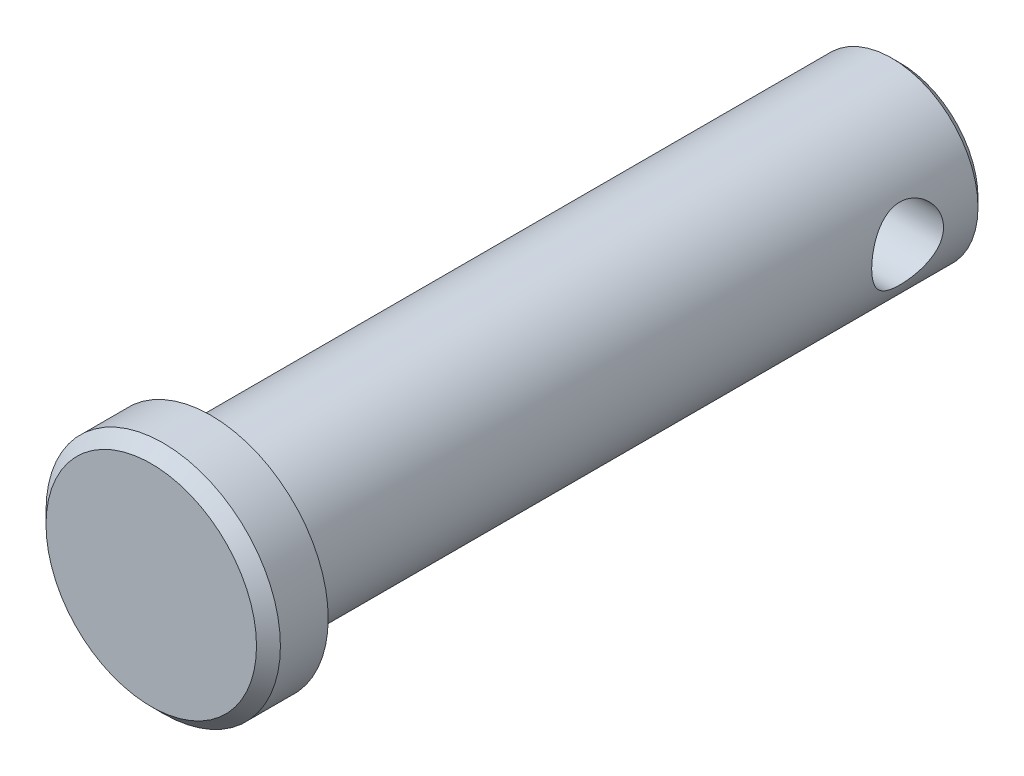
ISO-10303-21;
HEADER;
FILE_DESCRIPTION(('STEP AP214'),'2;1');
FILE_NAME('part.step','',(''),(''),'','','');
FILE_SCHEMA(('AUTOMOTIVE_DESIGN { 1 0 10303 214 1 1 1 1 }'));
ENDSEC;
DATA;
#1=APPLICATION_CONTEXT('core data for automotive mechanical design processes');
#2=APPLICATION_PROTOCOL_DEFINITION('international standard','automotive_design',2000,#1);
#3=PRODUCT_CONTEXT('',#1,'mechanical');
#4=PRODUCT('Part','Part','',(#3));
#5=PRODUCT_RELATED_PRODUCT_CATEGORY('part','',(#4));
#6=PRODUCT_DEFINITION_FORMATION('','',#4);
#7=PRODUCT_DEFINITION_CONTEXT('part definition',#1,'design');
#8=PRODUCT_DEFINITION('design','',#6,#7);
#9=PRODUCT_DEFINITION_SHAPE('','',#8);
#10=(LENGTH_UNIT() NAMED_UNIT(*) SI_UNIT(.MILLI.,.METRE.));
#11=(NAMED_UNIT(*) PLANE_ANGLE_UNIT() SI_UNIT($,.RADIAN.));
#12=(NAMED_UNIT(*) SI_UNIT($,.STERADIAN.) SOLID_ANGLE_UNIT());
#13=UNCERTAINTY_MEASURE_WITH_UNIT(LENGTH_MEASURE(1.E-05),#10,'distance_accuracy_value','');
#14=(GEOMETRIC_REPRESENTATION_CONTEXT(3) GLOBAL_UNCERTAINTY_ASSIGNED_CONTEXT((#13)) GLOBAL_UNIT_ASSIGNED_CONTEXT((#10,
#11,#12)) REPRESENTATION_CONTEXT('',''));
#15=CARTESIAN_POINT('',(0.,0.,0.));
#16=DIRECTION('',(0.,0.,1.));
#17=DIRECTION('',(1.,0.,0.));
#18=AXIS2_PLACEMENT_3D('',#15,#16,#17);
#19=CARTESIAN_POINT('',(0.,0.,19.05));
#20=DIRECTION('',(0.,0.,-1.));
#21=DIRECTION('',(-1.,0.,0.));
#22=AXIS2_PLACEMENT_3D('',#19,#20,#21);
#23=CYLINDRICAL_SURFACE('',#22,4.7625);
#24=CARTESIAN_POINT('',(0.,0.,-18.57375));
#25=DIRECTION('',(0.,0.,1.));
#26=DIRECTION('',(1.,0.,0.));
#27=AXIS2_PLACEMENT_3D('',#24,#25,#26);
#28=CIRCLE('',#27,4.7625);
#29=CARTESIAN_POINT('',(4.7625,0.,-18.57375));
#30=VERTEX_POINT('',#29);
#31=EDGE_CURVE('E40',#30,#30,#28,.T.);
#32=ORIENTED_EDGE('',*,*,#31,.T.);
#33=EDGE_LOOP('',(#32));
#34=FACE_BOUND('',#33,.T.);
#35=CARTESIAN_POINT('',(-4.7625,0.,-12.7));
#36=CARTESIAN_POINT('',(-4.76249140158045,-0.106295908560072,-12.7000114380824));
#37=CARTESIAN_POINT('',(-4.75890007347352,-0.212758967838845,-12.7085914841634));
#38=CARTESIAN_POINT('',(-4.74488118807538,-0.422667701710698,-12.7426070155608));
#39=CARTESIAN_POINT('',(-4.73443579242881,-0.526104765072406,-12.768086485087));
#40=CARTESIAN_POINT('',(-4.70783108848027,-0.726580864674275,-12.8347963582017));
#41=CARTESIAN_POINT('',(-4.69169114960318,-0.8236402825267,-12.8759734057807));
#42=CARTESIAN_POINT('',(-4.65526892272179,-1.00937973872918,-12.9726893568817));
#43=CARTESIAN_POINT('',(-4.63498788984898,-1.0980623041503,-13.0282239101163));
#44=CARTESIAN_POINT('',(-4.59117427508592,-1.26912434065072,-13.155023509863));
#45=CARTESIAN_POINT('',(-4.56753520905172,-1.35102801218445,-13.2268933277037));
#46=CARTESIAN_POINT('',(-4.52013183583765,-1.50202871598238,-13.3830446314673));
#47=CARTESIAN_POINT('',(-4.4963674694456,-1.57111900525552,-13.46733261077));
#48=CARTESIAN_POINT('',(-4.4500962212813,-1.69789058594091,-13.6509550093843));
#49=CARTESIAN_POINT('',(-4.42770874161498,-1.75484326694356,-13.7508256993771));
#50=CARTESIAN_POINT('',(-4.38841471116746,-1.85092880684824,-13.9597975469495));
#51=CARTESIAN_POINT('',(-4.37150533813807,-1.89007084577611,-14.0688939149316));
#52=CARTESIAN_POINT('',(-4.34623456677981,-1.94745924820552,-14.2877439856816));
#53=CARTESIAN_POINT('',(-4.33750065397212,-1.96662131880699,-14.397212892385));
#54=CARTESIAN_POINT('',(-4.32849855373462,-1.98636270823876,-14.6181338521399));
#55=CARTESIAN_POINT('',(-4.328225697501,-1.98695227536355,-14.7295847775409));
#56=CARTESIAN_POINT('',(-4.33586127302854,-1.97022164952332,-14.9421850959405));
#57=CARTESIAN_POINT('',(-4.34314413823751,-1.95427093765777,-15.0434692407961));
#58=CARTESIAN_POINT('',(-4.36401341403402,-1.90720965737545,-15.2417654444631));
#59=CARTESIAN_POINT('',(-4.37760103179407,-1.87609618568393,-15.3387766812432));
#60=CARTESIAN_POINT('',(-4.40985568326751,-1.79898609480019,-15.5282228534989));
#61=CARTESIAN_POINT('',(-4.42862465094254,-1.75268686068537,-15.6205164807));
#62=CARTESIAN_POINT('',(-4.46910350686474,-1.64673347596642,-15.7963834025347));
#63=CARTESIAN_POINT('',(-4.49081455356025,-1.58707405869977,-15.879953239099));
#64=CARTESIAN_POINT('',(-4.53696350793792,-1.45017484530084,-16.0434336844884));
#65=CARTESIAN_POINT('',(-4.561476802296,-1.37187540459195,-16.1224381757244));
#66=CARTESIAN_POINT('',(-4.6089200606614,-1.20289572579427,-16.2664989359477));
#67=CARTESIAN_POINT('',(-4.63184965292253,-1.11221259562442,-16.3315519375613));
#68=CARTESIAN_POINT('',(-4.67420775145901,-0.918286118550734,-16.4471918699908));
#69=CARTESIAN_POINT('',(-4.69354323137542,-0.814801174635692,-16.4974102441767));
#70=CARTESIAN_POINT('',(-4.72582051746,-0.599840689011346,-16.5794073091202));
#71=CARTESIAN_POINT('',(-4.73876585655208,-0.488369601737119,-16.6111961907108));
#72=CARTESIAN_POINT('',(-4.75614430383386,-0.268173379937138,-16.653535387501));
#73=CARTESIAN_POINT('',(-4.76106396412311,-0.159720415379841,-16.6653017236919));
#74=CARTESIAN_POINT('',(-4.76338979960382,0.0577130156000396,-16.6708871299874));
#75=CARTESIAN_POINT('',(-4.76079813192703,0.166693321604807,-16.664711352775));
#76=CARTESIAN_POINT('',(-4.74870808030392,0.376393459717026,-16.6354584028704));
#77=CARTESIAN_POINT('',(-4.73955883563333,0.477254834540024,-16.6132351978707));
#78=CARTESIAN_POINT('',(-4.71564663251208,0.673707613991605,-16.5537067411665));
#79=CARTESIAN_POINT('',(-4.7008829648603,0.769298351097896,-16.5163995840539));
#80=CARTESIAN_POINT('',(-4.666587546492,0.955848037292252,-16.426543576057));
#81=CARTESIAN_POINT('',(-4.64692192707484,1.04657086350783,-16.3735572592557));
#82=CARTESIAN_POINT('',(-4.60492164769306,1.21816211826739,-16.2543277627557));
#83=CARTESIAN_POINT('',(-4.58258587495364,1.29902640975558,-16.1880790481973));
#84=CARTESIAN_POINT('',(-4.53567939534007,1.45467932056039,-16.03866611718));
#85=CARTESIAN_POINT('',(-4.51106304400759,1.52862073304299,-15.9546313765093));
#86=CARTESIAN_POINT('',(-4.46380134619208,1.66158838069249,-15.7749537244526));
#87=CARTESIAN_POINT('',(-4.44115644808334,1.72061122865917,-15.6793081841649));
#88=CARTESIAN_POINT('',(-4.40025450662331,1.8227033683131,-15.4771499967072));
#89=CARTESIAN_POINT('',(-4.3820645555624,1.86553345201759,-15.3705019686202));
#90=CARTESIAN_POINT('',(-4.35305764608595,1.93226394648122,-15.1505116823265));
#91=CARTESIAN_POINT('',(-4.34223460919757,1.95617996596104,-15.0371750270577));
#92=CARTESIAN_POINT('',(-4.33011523702907,1.98285227553879,-14.8164253150213));
#93=CARTESIAN_POINT('',(-4.32814969660371,1.98709566405842,-14.7092278486105));
#94=CARTESIAN_POINT('',(-4.33218991655001,1.9782722614421,-14.4957119579385));
#95=CARTESIAN_POINT('',(-4.33819445320237,1.96520812768995,-14.389393401252));
#96=CARTESIAN_POINT('',(-4.3568866269235,1.92338967589029,-14.1857527633931));
#97=CARTESIAN_POINT('',(-4.36925013318788,1.89539409419702,-14.0882422808769));
#98=CARTESIAN_POINT('',(-4.39901300153713,1.82524921020888,-13.8992800160954));
#99=CARTESIAN_POINT('',(-4.41641377846563,1.78309593083637,-13.8078299449294));
#100=CARTESIAN_POINT('',(-4.45558790364021,1.68291328922589,-13.6275827651808));
#101=CARTESIAN_POINT('',(-4.47756125557966,1.62408172945392,-13.5392758008578));
#102=CARTESIAN_POINT('',(-4.5228460637297,1.49333596530074,-13.3733220287649));
#103=CARTESIAN_POINT('',(-4.54615798199076,1.42141722463767,-13.2956789337341));
#104=CARTESIAN_POINT('',(-4.59353273649544,1.26031949767388,-13.1474389678255));
#105=CARTESIAN_POINT('',(-4.61752660299969,1.17026489966908,-13.0777671628655));
#106=CARTESIAN_POINT('',(-4.66185477999957,0.97885262581445,-12.9544771174995));
#107=CARTESIAN_POINT('',(-4.68218742117825,0.877489827988868,-12.9008661926128));
#108=CARTESIAN_POINT('',(-4.71660828587906,0.667912140039744,-12.8123793703642));
#109=CARTESIAN_POINT('',(-4.73079417348867,0.559838210681758,-12.777208432995));
#110=CARTESIAN_POINT('',(-4.75172103007692,0.338789044681411,-12.7258662025889));
#111=CARTESIAN_POINT('',(-4.75848530476497,0.225830315707269,-12.7096354224838));
#112=CARTESIAN_POINT('',(-4.76206006515682,0.0749872800467031,-12.7010586067753));
#113=CARTESIAN_POINT('',(-4.76250303375275,0.0375040440476054,-12.6999959643381));
#114=CARTESIAN_POINT('',(-4.7625,0.,-12.7));
#115=B_SPLINE_CURVE_WITH_KNOTS('',3,(#35,#36,#37,#38,#39,#40,#41,#42,#43,#44,#45,#46,#47,#48,
#49,#50,#51,#52,#53,#54,#55,#56,#57,#58,#59,#60,#61,#62,#63,#64,#65,#66,#67,#68,#69,#70,#71,#72,
#73,#74,#75,#76,#77,#78,#79,#80,#81,#82,#83,#84,#85,#86,#87,#88,#89,#90,#91,#92,#93,#94,#95,#96,
#97,#98,#99,#100,#101,#102,#103,#104,#105,#106,#107,#108,#109,#110,#111,#112,#113,#114),
.UNSPECIFIED.,.T.,.F.,(4,2,2,2,2,2,2,2,2,2,2,2,2,2,2,2,2,2,2,2,2,2,2,2,2,2,2,2,2,2,2,2,2,2,2,2,
2,2,2,4),(0.,0.31878098372825,0.638394933248055,0.956932064901252,1.27537279350409,
1.60842223858481,1.94164645533701,2.29126612705861,2.64070539184808,2.97331246105872,
3.3057359947036,3.61267624559058,3.91967529066949,4.23320706980709,4.54686266326064,
4.88702574040535,5.22726839536908,5.5753643740904,5.92326768446545,6.24916903886785,
6.57497680895409,6.88461586205456,7.19429404105333,7.51359202244554,7.83302353682823,
8.17528349746503,8.5176210971904,8.86483476520742,9.21176159730895,9.53198305625932,
9.85215535434837,10.1574226931906,10.462775857341,10.7864893076844,11.1103151781368,
11.4577262432026,11.8052953096787,12.1471190861327,12.4878663512005,12.6003408219232),.UNSPECIFIED.);
#116=CARTESIAN_POINT('',(-4.7625,0.,-12.7));
#117=VERTEX_POINT('',#116);
#118=EDGE_CURVE('E51',#117,#117,#115,.T.);
#119=ORIENTED_EDGE('',*,*,#118,.T.);
#120=EDGE_LOOP('',(#119));
#121=FACE_BOUND('',#120,.T.);
#122=CARTESIAN_POINT('',(4.7625,0.,-16.66875));
#123=CARTESIAN_POINT('',(4.76249140158046,-0.106295908560073,-16.6687385619176));
#124=CARTESIAN_POINT('',(4.75890007347352,-0.212758967838847,-16.6601585158366));
#125=CARTESIAN_POINT('',(4.74488118807538,-0.4226677017107,-16.6261429844392));
#126=CARTESIAN_POINT('',(4.73443579242881,-0.526104765072408,-16.600663514913));
#127=CARTESIAN_POINT('',(4.70783108848027,-0.726580864674275,-16.5339536417983));
#128=CARTESIAN_POINT('',(4.69169114960318,-0.823640282526699,-16.4927765942193));
#129=CARTESIAN_POINT('',(4.65526892272179,-1.00937973872918,-16.3960606431183));
#130=CARTESIAN_POINT('',(4.63498788984898,-1.0980623041503,-16.3405260898837));
#131=CARTESIAN_POINT('',(4.59117427508592,-1.26912434065072,-16.213726490137));
#132=CARTESIAN_POINT('',(4.56753520905172,-1.35102801218446,-16.1418566722963));
#133=CARTESIAN_POINT('',(4.52013183583765,-1.50202871598238,-15.9857053685327));
#134=CARTESIAN_POINT('',(4.4963674694456,-1.57111900525552,-15.90141738923));
#135=CARTESIAN_POINT('',(4.4500962212813,-1.69789058594091,-15.7177949906157));
#136=CARTESIAN_POINT('',(4.42770874161498,-1.75484326694356,-15.6179243006229));
#137=CARTESIAN_POINT('',(4.38841471116746,-1.85092880684824,-15.4089524530505));
#138=CARTESIAN_POINT('',(4.37150533813807,-1.89007084577611,-15.2998560850684));
#139=CARTESIAN_POINT('',(4.34623456677981,-1.94745924820552,-15.0810060143184));
#140=CARTESIAN_POINT('',(4.33750065397212,-1.96662131880699,-14.971537107615));
#141=CARTESIAN_POINT('',(4.32849855373462,-1.98636270823876,-14.7506161478601));
#142=CARTESIAN_POINT('',(4.328225697501,-1.98695227536355,-14.6391652224591));
#143=CARTESIAN_POINT('',(4.33586127302854,-1.97022164952332,-14.4265649040595));
#144=CARTESIAN_POINT('',(4.34314413823751,-1.95427093765777,-14.3252807592039));
#145=CARTESIAN_POINT('',(4.36401341403402,-1.90720965737545,-14.1269845555369));
#146=CARTESIAN_POINT('',(4.37760103179407,-1.87609618568393,-14.0299733187568));
#147=CARTESIAN_POINT('',(4.40985568326751,-1.79898609480019,-13.8405271465011));
#148=CARTESIAN_POINT('',(4.42862465094254,-1.75268686068537,-13.7482335193));
#149=CARTESIAN_POINT('',(4.46910350686474,-1.64673347596643,-13.5723665974653));
#150=CARTESIAN_POINT('',(4.49081455356025,-1.58707405869977,-13.488796760901));
#151=CARTESIAN_POINT('',(4.53696350793792,-1.45017484530084,-13.3253163155116));
#152=CARTESIAN_POINT('',(4.561476802296,-1.37187540459195,-13.2463118242756));
#153=CARTESIAN_POINT('',(4.6089200606614,-1.20289572579427,-13.1022510640523));
#154=CARTESIAN_POINT('',(4.63184965292253,-1.11221259562442,-13.0371980624387));
#155=CARTESIAN_POINT('',(4.67420775145901,-0.918286118550734,-12.9215581300092));
#156=CARTESIAN_POINT('',(4.69354323137542,-0.814801174635692,-12.8713397558233));
#157=CARTESIAN_POINT('',(4.72582051746,-0.599840689011345,-12.7893426908798));
#158=CARTESIAN_POINT('',(4.73876585655208,-0.488369601737118,-12.7575538092892));
#159=CARTESIAN_POINT('',(4.75614430383386,-0.268173379937137,-12.715214612499));
#160=CARTESIAN_POINT('',(4.76106396412311,-0.15972041537984,-12.7034482763081));
#161=CARTESIAN_POINT('',(4.76338979960382,0.0577130156000403,-12.6978628700126));
#162=CARTESIAN_POINT('',(4.76079813192703,0.166693321604808,-12.704038647225));
#163=CARTESIAN_POINT('',(4.74870808030392,0.376393459717027,-12.7332915971296));
#164=CARTESIAN_POINT('',(4.73955883563333,0.477254834540025,-12.7555148021293));
#165=CARTESIAN_POINT('',(4.71564663251208,0.673707613991605,-12.8150432588335));
#166=CARTESIAN_POINT('',(4.70088296486029,0.769298351097896,-12.8523504159461));
#167=CARTESIAN_POINT('',(4.666587546492,0.955848037292252,-12.942206423943));
#168=CARTESIAN_POINT('',(4.64692192707484,1.04657086350782,-12.9951927407443));
#169=CARTESIAN_POINT('',(4.60492164769306,1.21816211826739,-13.1144222372443));
#170=CARTESIAN_POINT('',(4.58258587495364,1.29902640975558,-13.1806709518027));
#171=CARTESIAN_POINT('',(4.53567939534007,1.45467932056039,-13.3300838828199));
#172=CARTESIAN_POINT('',(4.51106304400759,1.52862073304299,-13.4141186234907));
#173=CARTESIAN_POINT('',(4.46380134619208,1.66158838069249,-13.5937962755474));
#174=CARTESIAN_POINT('',(4.44115644808334,1.72061122865917,-13.6894418158351));
#175=CARTESIAN_POINT('',(4.40025450662331,1.8227033683131,-13.8916000032928));
#176=CARTESIAN_POINT('',(4.3820645555624,1.86553345201759,-13.9982480313798));
#177=CARTESIAN_POINT('',(4.35305764608594,1.93226394648122,-14.2182383176735));
#178=CARTESIAN_POINT('',(4.34223460919756,1.95617996596104,-14.3315749729423));
#179=CARTESIAN_POINT('',(4.33011523702907,1.98285227553879,-14.5523246849787));
#180=CARTESIAN_POINT('',(4.32814969660371,1.98709566405842,-14.6595221513895));
#181=CARTESIAN_POINT('',(4.33218991655001,1.9782722614421,-14.8730380420615));
#182=CARTESIAN_POINT('',(4.33819445320237,1.96520812768995,-14.979356598748));
#183=CARTESIAN_POINT('',(4.3568866269235,1.92338967589029,-15.1829972366069));
#184=CARTESIAN_POINT('',(4.36925013318788,1.89539409419702,-15.2805077191231));
#185=CARTESIAN_POINT('',(4.39901300153713,1.82524921020888,-15.4694699839046));
#186=CARTESIAN_POINT('',(4.41641377846563,1.78309593083637,-15.5609200550706));
#187=CARTESIAN_POINT('',(4.45558790364021,1.68291328922589,-15.7411672348192));
#188=CARTESIAN_POINT('',(4.47756125557966,1.62408172945392,-15.8294741991422));
#189=CARTESIAN_POINT('',(4.5228460637297,1.49333596530074,-15.9954279712351));
#190=CARTESIAN_POINT('',(4.54615798199076,1.42141722463767,-16.0730710662659));
#191=CARTESIAN_POINT('',(4.59353273649544,1.26031949767387,-16.2213110321745));
#192=CARTESIAN_POINT('',(4.61752660299969,1.17026489966908,-16.2909828371345));
#193=CARTESIAN_POINT('',(4.66185477999957,0.978852625814449,-16.4142728825005));
#194=CARTESIAN_POINT('',(4.68218742117825,0.877489827988868,-16.4678838073872));
#195=CARTESIAN_POINT('',(4.71660828587906,0.667912140039744,-16.5563706296358));
#196=CARTESIAN_POINT('',(4.73079417348868,0.559838210681757,-16.591541567005));
#197=CARTESIAN_POINT('',(4.75172103007692,0.33878904468141,-16.6428837974111));
#198=CARTESIAN_POINT('',(4.75848530476497,0.225830315707268,-16.6591145775162));
#199=CARTESIAN_POINT('',(4.76206006515682,0.0749872800467027,-16.6676913932247));
#200=CARTESIAN_POINT('',(4.76250303375276,0.0375040440476052,-16.6687540356619));
#201=CARTESIAN_POINT('',(4.7625,0.,-16.66875));
#202=B_SPLINE_CURVE_WITH_KNOTS('',3,(#122,#123,#124,#125,#126,#127,#128,#129,#130,#131,#132,
#133,#134,#135,#136,#137,#138,#139,#140,#141,#142,#143,#144,#145,#146,#147,#148,#149,#150,#151,
#152,#153,#154,#155,#156,#157,#158,#159,#160,#161,#162,#163,#164,#165,#166,#167,#168,#169,#170,
#171,#172,#173,#174,#175,#176,#177,#178,#179,#180,#181,#182,#183,#184,#185,#186,#187,#188,#189,
#190,#191,#192,#193,#194,#195,#196,#197,#198,#199,#200,#201),.UNSPECIFIED.,.T.,.F.,(4,2,2,2,2,2,
2,2,2,2,2,2,2,2,2,2,2,2,2,2,2,2,2,2,2,2,2,2,2,2,2,2,2,2,2,2,2,2,2,4),(0.,0.318780983728252,
0.638394933248055,0.956932064901251,1.27537279350409,1.60842223858481,1.94164645533701,
2.29126612705861,2.64070539184808,2.97331246105872,3.3057359947036,3.61267624559057,
3.91967529066949,4.23320706980708,4.54686266326064,4.88702574040535,5.22726839536907,
5.5753643740904,5.92326768446545,6.24916903886785,6.57497680895409,6.88461586205456,
7.19429404105332,7.51359202244554,7.83302353682823,8.17528349746503,8.5176210971904,
8.86483476520742,9.21176159730895,9.53198305625933,9.85215535434837,10.1574226931906,
10.462775857341,10.7864893076844,11.1103151781368,11.4577262432026,11.8052953096787,
12.1471190861327,12.4878663512005,12.6003408219232),.UNSPECIFIED.);
#203=CARTESIAN_POINT('',(4.7625,0.,-16.66875));
#204=VERTEX_POINT('',#203);
#205=EDGE_CURVE('E59',#204,#204,#202,.T.);
#206=ORIENTED_EDGE('',*,*,#205,.T.);
#207=EDGE_LOOP('',(#206));
#208=FACE_BOUND('',#207,.T.);
#209=CARTESIAN_POINT('',(0.,0.,19.05));
#210=DIRECTION('',(0.,0.,1.));
#211=DIRECTION('',(1.,0.,0.));
#212=AXIS2_PLACEMENT_3D('',#209,#210,#211);
#213=CIRCLE('',#212,4.7625);
#214=CARTESIAN_POINT('',(4.7625,0.,19.05));
#215=VERTEX_POINT('',#214);
#216=EDGE_CURVE('E97',#215,#215,#213,.T.);
#217=ORIENTED_EDGE('',*,*,#216,.F.);
#218=EDGE_LOOP('',(#217));
#219=FACE_BOUND('',#218,.T.);
#220=ADVANCED_FACE('F33',(#34,#121,#208,#219),#23,.T.);
#221=CARTESIAN_POINT('',(0.,0.,-19.05));
#222=DIRECTION('',(0.,0.,1.));
#223=DIRECTION('',(1.,0.,0.));
#224=AXIS2_PLACEMENT_3D('',#221,#222,#223);
#225=PLANE('',#224);
#226=CARTESIAN_POINT('',(0.,0.,-19.05));
#227=DIRECTION('',(0.,0.,1.));
#228=DIRECTION('',(1.,0.,0.));
#229=AXIS2_PLACEMENT_3D('',#226,#227,#228);
#230=CIRCLE('',#229,4.28624999999996);
#231=CARTESIAN_POINT('',(4.28624999999996,0.,-19.05));
#232=VERTEX_POINT('',#231);
#233=EDGE_CURVE('E10',#232,#232,#230,.F.);
#234=ORIENTED_EDGE('',*,*,#233,.T.);
#235=EDGE_LOOP('',(#234));
#236=FACE_BOUND('',#235,.T.);
#237=ADVANCED_FACE('F79',(#236),#225,.F.);
#238=CARTESIAN_POINT('',(0.,0.,19.05));
#239=DIRECTION('',(0.,0.,1.));
#240=DIRECTION('',(1.,0.,0.));
#241=AXIS2_PLACEMENT_3D('',#238,#239,#240);
#242=PLANE('',#241);
#243=CARTESIAN_POINT('',(0.,0.,19.05));
#244=DIRECTION('',(0.,0.,1.));
#245=DIRECTION('',(1.,0.,0.));
#246=AXIS2_PLACEMENT_3D('',#243,#244,#245);
#247=CIRCLE('',#246,6.477);
#248=CARTESIAN_POINT('',(-6.477,0.,19.05));
#249=VERTEX_POINT('',#248);
#250=EDGE_CURVE('E58',#249,#249,#247,.T.);
#251=ORIENTED_EDGE('',*,*,#250,.F.);
#252=EDGE_LOOP('',(#251));
#253=FACE_BOUND('',#252,.T.);
#254=ORIENTED_EDGE('',*,*,#216,.T.);
#255=EDGE_LOOP('',(#254));
#256=FACE_BOUND('',#255,.T.);
#257=ADVANCED_FACE('F76',(#253,#256),#242,.F.);
#258=CARTESIAN_POINT('',(0.,0.,22.352));
#259=DIRECTION('',(0.,0.,-1.));
#260=DIRECTION('',(-1.,0.,0.));
#261=AXIS2_PLACEMENT_3D('',#258,#259,#260);
#262=CYLINDRICAL_SURFACE('',#261,6.477);
#263=CARTESIAN_POINT('',(0.,0.,21.6916));
#264=DIRECTION('',(0.,0.,1.));
#265=DIRECTION('',(1.,0.,0.));
#266=AXIS2_PLACEMENT_3D('',#263,#264,#265);
#267=CIRCLE('',#266,6.477);
#268=CARTESIAN_POINT('',(-6.477,0.,21.6916));
#269=VERTEX_POINT('',#268);
#270=EDGE_CURVE('E44',#269,#269,#267,.F.);
#271=CARTESIAN_POINT('',(-6.477,0.,21.6916));
#272=CARTESIAN_POINT('',(-6.477,0.,21.6640833333334));
#273=CARTESIAN_POINT('',(-6.477,0.,21.6365666666667));
#274=CARTESIAN_POINT('',(-6.477,0.,21.5815333333334));
#275=CARTESIAN_POINT('',(-6.477,0.,21.5540166666667));
#276=CARTESIAN_POINT('',(-6.477,0.,21.4989833333334));
#277=CARTESIAN_POINT('',(-6.477,0.,21.4714666666667));
#278=CARTESIAN_POINT('',(-6.477,0.,21.4164333333334));
#279=CARTESIAN_POINT('',(-6.477,0.,21.3889166666667));
#280=CARTESIAN_POINT('',(-6.477,0.,21.3338833333334));
#281=CARTESIAN_POINT('',(-6.477,0.,21.3063666666667));
#282=CARTESIAN_POINT('',(-6.477,0.,21.2513333333334));
#283=CARTESIAN_POINT('',(-6.477,0.,21.2238166666667));
#284=CARTESIAN_POINT('',(-6.477,0.,21.1687833333334));
#285=CARTESIAN_POINT('',(-6.477,0.,21.1412666666667));
#286=CARTESIAN_POINT('',(-6.477,0.,21.0862333333334));
#287=CARTESIAN_POINT('',(-6.477,0.,21.0587166666667));
#288=CARTESIAN_POINT('',(-6.477,0.,21.0036833333333));
#289=CARTESIAN_POINT('',(-6.477,0.,20.9761666666667));
#290=CARTESIAN_POINT('',(-6.477,0.,20.9211333333333));
#291=CARTESIAN_POINT('',(-6.477,0.,20.8936166666667));
#292=CARTESIAN_POINT('',(-6.477,0.,20.8385833333333));
#293=CARTESIAN_POINT('',(-6.477,0.,20.8110666666667));
#294=CARTESIAN_POINT('',(-6.477,0.,20.7560333333333));
#295=CARTESIAN_POINT('',(-6.477,0.,20.7285166666667));
#296=CARTESIAN_POINT('',(-6.477,0.,20.6734833333333));
#297=CARTESIAN_POINT('',(-6.477,0.,20.6459666666667));
#298=CARTESIAN_POINT('',(-6.477,0.,20.5909333333333));
#299=CARTESIAN_POINT('',(-6.477,0.,20.5634166666667));
#300=CARTESIAN_POINT('',(-6.477,0.,20.5083833333333));
#301=CARTESIAN_POINT('',(-6.477,0.,20.4808666666667));
#302=CARTESIAN_POINT('',(-6.477,0.,20.4258333333333));
#303=CARTESIAN_POINT('',(-6.477,0.,20.3983166666667));
#304=CARTESIAN_POINT('',(-6.477,0.,20.3432833333333));
#305=CARTESIAN_POINT('',(-6.477,0.,20.3157666666667));
#306=CARTESIAN_POINT('',(-6.477,0.,20.2607333333333));
#307=CARTESIAN_POINT('',(-6.477,0.,20.2332166666667));
#308=CARTESIAN_POINT('',(-6.477,0.,20.1781833333333));
#309=CARTESIAN_POINT('',(-6.477,0.,20.1506666666667));
#310=CARTESIAN_POINT('',(-6.477,0.,20.0956333333333));
#311=CARTESIAN_POINT('',(-6.477,0.,20.0681166666667));
#312=CARTESIAN_POINT('',(-6.477,0.,20.0130833333333));
#313=CARTESIAN_POINT('',(-6.477,0.,19.9855666666667));
#314=CARTESIAN_POINT('',(-6.477,0.,19.9305333333333));
#315=CARTESIAN_POINT('',(-6.477,0.,19.9030166666667));
#316=CARTESIAN_POINT('',(-6.477,0.,19.8479833333333));
#317=CARTESIAN_POINT('',(-6.477,0.,19.8204666666667));
#318=CARTESIAN_POINT('',(-6.477,0.,19.7654333333333));
#319=CARTESIAN_POINT('',(-6.477,0.,19.7379166666667));
#320=CARTESIAN_POINT('',(-6.477,0.,19.6828833333333));
#321=CARTESIAN_POINT('',(-6.477,0.,19.6553666666667));
#322=CARTESIAN_POINT('',(-6.477,0.,19.6003333333333));
#323=CARTESIAN_POINT('',(-6.477,0.,19.5728166666667));
#324=CARTESIAN_POINT('',(-6.477,0.,19.5177833333333));
#325=CARTESIAN_POINT('',(-6.477,0.,19.4902666666667));
#326=CARTESIAN_POINT('',(-6.477,0.,19.4352333333333));
#327=CARTESIAN_POINT('',(-6.477,0.,19.4077166666667));
#328=CARTESIAN_POINT('',(-6.477,0.,19.3526833333333));
#329=CARTESIAN_POINT('',(-6.477,0.,19.3251666666667));
#330=CARTESIAN_POINT('',(-6.477,0.,19.2701333333333));
#331=CARTESIAN_POINT('',(-6.477,0.,19.2426166666667));
#332=CARTESIAN_POINT('',(-6.477,0.,19.1875833333333));
#333=CARTESIAN_POINT('',(-6.477,0.,19.1600666666667));
#334=CARTESIAN_POINT('',(-6.477,0.,19.1050333333333));
#335=CARTESIAN_POINT('',(-6.477,0.,19.0775166666667));
#336=CARTESIAN_POINT('',(-6.477,0.,19.05));
#337=B_SPLINE_CURVE_WITH_KNOTS('',3,(#271,#272,#273,#274,#275,#276,#277,#278,#279,#280,#281,
#282,#283,#284,#285,#286,#287,#288,#289,#290,#291,#292,#293,#294,#295,#296,#297,#298,#299,#300,
#301,#302,#303,#304,#305,#306,#307,#308,#309,#310,#311,#312,#313,#314,#315,#316,#317,#318,#319,
#320,#321,#322,#323,#324,#325,#326,#327,#328,#329,#330,#331,#332,#333,#334,#335,#336),
.UNSPECIFIED.,.F.,.F.,(4,2,2,2,2,2,2,2,2,2,2,2,2,2,2,2,2,2,2,2,2,2,2,2,2,2,2,2,2,2,2,2,4),(0.,
0.0825500000000007,0.165100000000001,0.247650000000002,0.330200000000003,0.412750000000003,
0.495300000000004,0.577850000000005,0.660400000000005,0.742950000000006,0.825500000000007,
0.908050000000007,0.990600000000008,1.07315000000001,1.15570000000001,1.23825000000001,
1.32080000000001,1.40335000000001,1.48590000000001,1.56845000000001,1.65100000000001,
1.73355000000001,1.81610000000001,1.89865000000002,1.98120000000002,2.06375000000002,
2.14630000000002,2.22885000000002,2.31140000000002,2.39395000000002,2.47650000000002,
2.55905000000002,2.64160000000002),.UNSPECIFIED.);
#338=EDGE_CURVE('BSEAM74',#269,#249,#337,.T.);
#339=ORIENTED_EDGE('',*,*,#270,.T.);
#340=ORIENTED_EDGE('',*,*,#250,.T.);
#341=ORIENTED_EDGE('',*,*,#338,.T.);
#342=ORIENTED_EDGE('',*,*,#338,.F.);
#343=EDGE_LOOP('',(#339,#341,#340,#342));
#344=FACE_BOUND('',#343,.T.);
#345=ADVANCED_FACE('F74',(#344),#262,.T.);
#346=CARTESIAN_POINT('',(0.,0.,22.352));
#347=DIRECTION('',(0.,0.,1.));
#348=DIRECTION('',(1.,0.,0.));
#349=AXIS2_PLACEMENT_3D('',#346,#347,#348);
#350=PLANE('',#349);
#351=CARTESIAN_POINT('',(0.,0.,22.352));
#352=DIRECTION('',(0.,0.,1.));
#353=DIRECTION('',(1.,0.,0.));
#354=AXIS2_PLACEMENT_3D('',#351,#352,#353);
#355=CIRCLE('',#354,5.81660000000003);
#356=CARTESIAN_POINT('',(5.81660000000003,0.,22.352));
#357=VERTEX_POINT('',#356);
#358=EDGE_CURVE('E48',#357,#357,#355,.T.);
#359=ORIENTED_EDGE('',*,*,#358,.T.);
#360=EDGE_LOOP('',(#359));
#361=FACE_BOUND('',#360,.T.);
#362=ADVANCED_FACE('F70',(#361),#350,.T.);
#363=CARTESIAN_POINT('',(0.,0.,22.352));
#364=DIRECTION('',(0.,0.,-1.));
#365=DIRECTION('',(-1.,0.,0.));
#366=AXIS2_PLACEMENT_3D('',#363,#364,#365);
#367=CONICAL_SURFACE('',#366,5.81660000000003,0.785398163397444);
#368=ORIENTED_EDGE('',*,*,#270,.F.);
#369=EDGE_LOOP('',(#368));
#370=FACE_BOUND('',#369,.T.);
#371=ORIENTED_EDGE('',*,*,#358,.F.);
#372=EDGE_LOOP('',(#371));
#373=FACE_BOUND('',#372,.T.);
#374=ADVANCED_FACE('F68',(#370,#373),#367,.T.);
#375=CARTESIAN_POINT('',(-6.477,0.,-14.684375));
#376=DIRECTION('',(1.,0.,0.));
#377=DIRECTION('',(0.,0.,-1.));
#378=AXIS2_PLACEMENT_3D('',#375,#376,#377);
#379=CYLINDRICAL_SURFACE('',#378,1.984375);
#380=ORIENTED_EDGE('',*,*,#205,.F.);
#381=EDGE_LOOP('',(#380));
#382=FACE_BOUND('',#381,.T.);
#383=ORIENTED_EDGE('',*,*,#118,.F.);
#384=EDGE_LOOP('',(#383));
#385=FACE_BOUND('',#384,.T.);
#386=ADVANCED_FACE('F64',(#382,#385),#379,.F.);
#387=CARTESIAN_POINT('',(0.,0.,-18.57375));
#388=DIRECTION('',(0.,0.,1.));
#389=DIRECTION('',(1.,0.,0.));
#390=AXIS2_PLACEMENT_3D('',#387,#388,#389);
#391=CONICAL_SURFACE('',#390,4.7625,0.785398163397443);
#392=ORIENTED_EDGE('',*,*,#233,.F.);
#393=EDGE_LOOP('',(#392));
#394=FACE_BOUND('',#393,.T.);
#395=ORIENTED_EDGE('',*,*,#31,.F.);
#396=EDGE_LOOP('',(#395));
#397=FACE_BOUND('',#396,.T.);
#398=ADVANCED_FACE('F35',(#394,#397),#391,.T.);
#399=CLOSED_SHELL('',(#220,#237,#257,#345,#362,#374,#386,#398));
#400=MANIFOLD_SOLID_BREP('B2',#399);
#401=ADVANCED_BREP_SHAPE_REPRESENTATION('',(#18,#400),#14);
#402=SHAPE_DEFINITION_REPRESENTATION(#9,#401);
ENDSEC;
END-ISO-10303-21;
